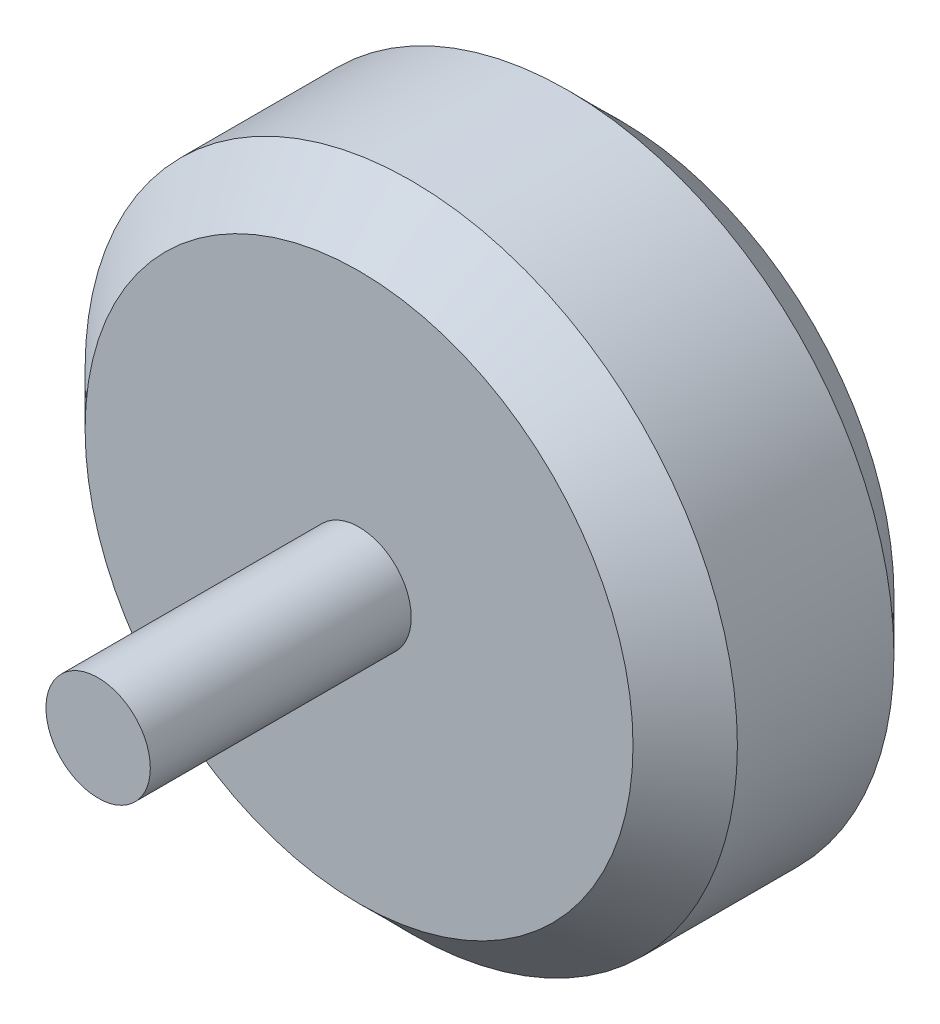
ISO-10303-21;
HEADER;
FILE_DESCRIPTION(('STEP AP214'),'2;1');
FILE_NAME('part.step','',(''),(''),'','','');
FILE_SCHEMA(('AUTOMOTIVE_DESIGN { 1 0 10303 214 1 1 1 1 }'));
ENDSEC;
DATA;
#1=APPLICATION_CONTEXT('core data for automotive mechanical design processes');
#2=APPLICATION_PROTOCOL_DEFINITION('international standard','automotive_design',2000,#1);
#3=PRODUCT_CONTEXT('',#1,'mechanical');
#4=PRODUCT('Part','Part','',(#3));
#5=PRODUCT_RELATED_PRODUCT_CATEGORY('part','',(#4));
#6=PRODUCT_DEFINITION_FORMATION('','',#4);
#7=PRODUCT_DEFINITION_CONTEXT('part definition',#1,'design');
#8=PRODUCT_DEFINITION('design','',#6,#7);
#9=PRODUCT_DEFINITION_SHAPE('','',#8);
#10=(LENGTH_UNIT() NAMED_UNIT(*) SI_UNIT(.MILLI.,.METRE.));
#11=(NAMED_UNIT(*) PLANE_ANGLE_UNIT() SI_UNIT($,.RADIAN.));
#12=(NAMED_UNIT(*) SI_UNIT($,.STERADIAN.) SOLID_ANGLE_UNIT());
#13=UNCERTAINTY_MEASURE_WITH_UNIT(LENGTH_MEASURE(1.E-05),#10,'distance_accuracy_value','');
#14=(GEOMETRIC_REPRESENTATION_CONTEXT(3) GLOBAL_UNCERTAINTY_ASSIGNED_CONTEXT((#13)) GLOBAL_UNIT_ASSIGNED_CONTEXT((#10,
#11,#12)) REPRESENTATION_CONTEXT('',''));
#15=CARTESIAN_POINT('',(0.,0.,0.));
#16=DIRECTION('',(0.,0.,1.));
#17=DIRECTION('',(1.,0.,0.));
#18=AXIS2_PLACEMENT_3D('',#15,#16,#17);
#19=CARTESIAN_POINT('',(-55.1107059078754,20.7,5.));
#20=DIRECTION('',(0.,0.,-1.));
#21=DIRECTION('',(-1.,0.,0.));
#22=AXIS2_PLACEMENT_3D('',#19,#20,#21);
#23=CYLINDRICAL_SURFACE('',#22,12.5);
#24=CARTESIAN_POINT('',(-55.1107059078754,20.7,2.99999999999998));
#25=DIRECTION('',(0.,0.,1.));
#26=DIRECTION('',(1.,0.,0.));
#27=AXIS2_PLACEMENT_3D('',#24,#25,#26);
#28=CIRCLE('',#27,12.5);
#29=CARTESIAN_POINT('',(-42.6107059078754,20.7,2.99999999999998));
#30=VERTEX_POINT('',#29);
#31=EDGE_CURVE('E55',#30,#30,#28,.F.);
#32=ORIENTED_EDGE('',*,*,#31,.T.);
#33=EDGE_LOOP('',(#32));
#34=FACE_BOUND('',#33,.T.);
#35=CARTESIAN_POINT('',(-55.1107059078754,20.7,-3.));
#36=DIRECTION('',(0.,0.,1.));
#37=DIRECTION('',(1.,0.,0.));
#38=AXIS2_PLACEMENT_3D('',#35,#36,#37);
#39=CIRCLE('',#38,12.5);
#40=CARTESIAN_POINT('',(-42.6107059078754,20.7,-3.));
#41=VERTEX_POINT('',#40);
#42=EDGE_CURVE('E56',#41,#41,#39,.T.);
#43=ORIENTED_EDGE('',*,*,#42,.T.);
#44=EDGE_LOOP('',(#43));
#45=FACE_BOUND('',#44,.T.);
#46=ADVANCED_FACE('F39',(#34,#45),#23,.T.);
#47=CARTESIAN_POINT('',(-55.1107059078754,20.7,5.));
#48=DIRECTION('',(0.,0.,1.));
#49=DIRECTION('',(1.,0.,0.));
#50=AXIS2_PLACEMENT_3D('',#47,#48,#49);
#51=PLANE('',#50);
#52=CARTESIAN_POINT('',(-55.1107059078754,20.7,5.));
#53=DIRECTION('',(0.,0.,1.));
#54=DIRECTION('',(1.,0.,0.));
#55=AXIS2_PLACEMENT_3D('',#52,#53,#54);
#56=CIRCLE('',#55,2.);
#57=CARTESIAN_POINT('',(-53.1107059078754,20.7,5.));
#58=VERTEX_POINT('',#57);
#59=EDGE_CURVE('E10',#58,#58,#56,.T.);
#60=ORIENTED_EDGE('',*,*,#59,.F.);
#61=EDGE_LOOP('',(#60));
#62=FACE_BOUND('',#61,.T.);
#63=CARTESIAN_POINT('',(-55.1107059078754,20.7,5.));
#64=DIRECTION('',(0.,0.,1.));
#65=DIRECTION('',(1.,0.,0.));
#66=AXIS2_PLACEMENT_3D('',#63,#64,#65);
#67=CIRCLE('',#66,10.5);
#68=CARTESIAN_POINT('',(-44.6107059078754,20.7,5.));
#69=VERTEX_POINT('',#68);
#70=EDGE_CURVE('E57',#69,#69,#67,.T.);
#71=ORIENTED_EDGE('',*,*,#70,.T.);
#72=EDGE_LOOP('',(#71));
#73=FACE_BOUND('',#72,.T.);
#74=ADVANCED_FACE('F75',(#62,#73),#51,.T.);
#75=CARTESIAN_POINT('',(-55.1107059078754,20.7,-5.));
#76=DIRECTION('',(0.,0.,1.));
#77=DIRECTION('',(1.,0.,0.));
#78=AXIS2_PLACEMENT_3D('',#75,#76,#77);
#79=PLANE('',#78);
#80=CARTESIAN_POINT('',(-55.1107059078754,20.7,-5.));
#81=DIRECTION('',(0.,0.,1.));
#82=DIRECTION('',(1.,0.,0.));
#83=AXIS2_PLACEMENT_3D('',#80,#81,#82);
#84=CIRCLE('',#83,10.5);
#85=CARTESIAN_POINT('',(-44.6107059078754,20.7,-5.));
#86=VERTEX_POINT('',#85);
#87=EDGE_CURVE('E42',#86,#86,#84,.F.);
#88=ORIENTED_EDGE('',*,*,#87,.T.);
#89=EDGE_LOOP('',(#88));
#90=FACE_BOUND('',#89,.T.);
#91=ADVANCED_FACE('F68',(#90),#79,.F.);
#92=CARTESIAN_POINT('',(-55.1107059078754,20.7,5.));
#93=DIRECTION('',(0.,0.,-1.));
#94=DIRECTION('',(-1.,0.,0.));
#95=AXIS2_PLACEMENT_3D('',#92,#93,#94);
#96=CONICAL_SURFACE('',#95,10.5,0.785398163397444);
#97=ORIENTED_EDGE('',*,*,#31,.F.);
#98=EDGE_LOOP('',(#97));
#99=FACE_BOUND('',#98,.T.);
#100=ORIENTED_EDGE('',*,*,#70,.F.);
#101=EDGE_LOOP('',(#100));
#102=FACE_BOUND('',#101,.T.);
#103=ADVANCED_FACE('F69',(#99,#102),#96,.T.);
#104=CARTESIAN_POINT('',(-55.1107059078754,20.7,-3.));
#105=DIRECTION('',(0.,0.,1.));
#106=DIRECTION('',(1.,0.,0.));
#107=AXIS2_PLACEMENT_3D('',#104,#105,#106);
#108=CONICAL_SURFACE('',#107,12.5,0.785398163397448);
#109=ORIENTED_EDGE('',*,*,#87,.F.);
#110=EDGE_LOOP('',(#109));
#111=FACE_BOUND('',#110,.T.);
#112=ORIENTED_EDGE('',*,*,#42,.F.);
#113=EDGE_LOOP('',(#112));
#114=FACE_BOUND('',#113,.T.);
#115=ADVANCED_FACE('F45',(#111,#114),#108,.T.);
#116=CARTESIAN_POINT('',(-55.1107059078754,20.7,15.));
#117=DIRECTION('',(0.,0.,-1.));
#118=DIRECTION('',(-1.,0.,0.));
#119=AXIS2_PLACEMENT_3D('',#116,#117,#118);
#120=CYLINDRICAL_SURFACE('',#119,2.);
#121=CARTESIAN_POINT('',(-55.1107059078754,20.7,15.));
#122=DIRECTION('',(0.,0.,1.));
#123=DIRECTION('',(1.,0.,0.));
#124=AXIS2_PLACEMENT_3D('',#121,#122,#123);
#125=CIRCLE('',#124,2.);
#126=CARTESIAN_POINT('',(-53.1107059078754,20.7,15.));
#127=VERTEX_POINT('',#126);
#128=EDGE_CURVE('E54',#127,#127,#125,.T.);
#129=ORIENTED_EDGE('',*,*,#128,.F.);
#130=EDGE_LOOP('',(#129));
#131=FACE_BOUND('',#130,.T.);
#132=ORIENTED_EDGE('',*,*,#59,.T.);
#133=EDGE_LOOP('',(#132));
#134=FACE_BOUND('',#133,.T.);
#135=ADVANCED_FACE('F88',(#131,#134),#120,.T.);
#136=CARTESIAN_POINT('',(-55.1107059078754,20.7,15.));
#137=DIRECTION('',(0.,0.,1.));
#138=DIRECTION('',(1.,0.,0.));
#139=AXIS2_PLACEMENT_3D('',#136,#137,#138);
#140=PLANE('',#139);
#141=ORIENTED_EDGE('',*,*,#128,.T.);
#142=EDGE_LOOP('',(#141));
#143=FACE_BOUND('',#142,.T.);
#144=ADVANCED_FACE('F91',(#143),#140,.T.);
#145=CLOSED_SHELL('',(#46,#74,#91,#103,#115,#135,#144));
#146=MANIFOLD_SOLID_BREP('B2',#145);
#147=ADVANCED_BREP_SHAPE_REPRESENTATION('',(#18,#146),#14);
#148=SHAPE_DEFINITION_REPRESENTATION(#9,#147);
ENDSEC;
END-ISO-10303-21;
